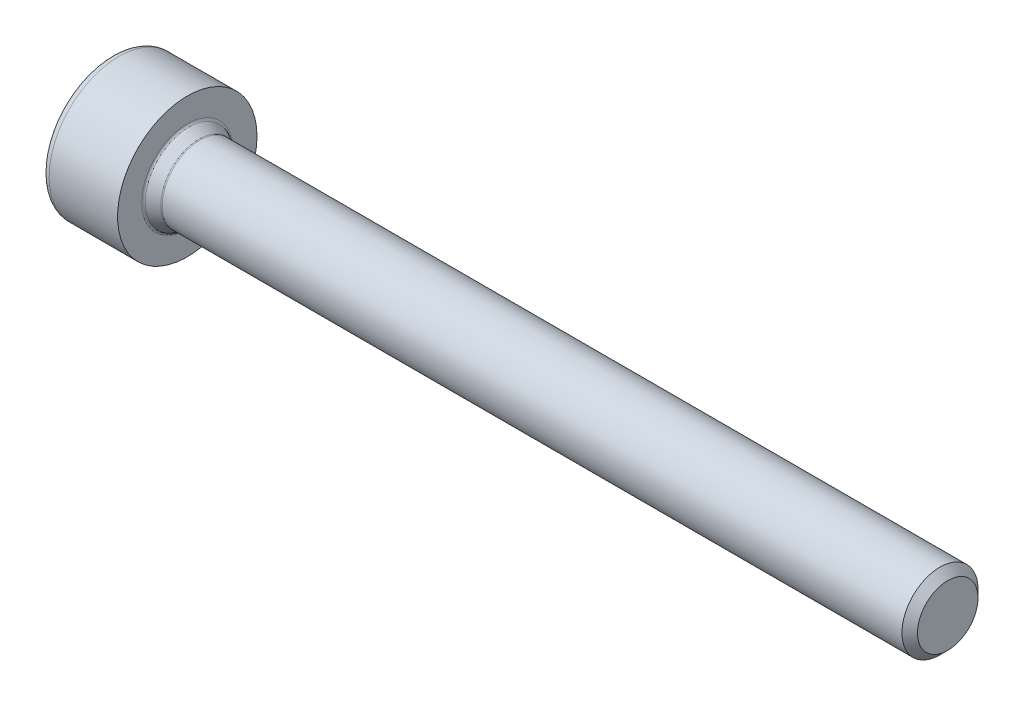
ISO-10303-21;
HEADER;
FILE_DESCRIPTION(('STEP AP214'),'2;1');
FILE_NAME('part.step','',(''),(''),'','','');
FILE_SCHEMA(('AUTOMOTIVE_DESIGN { 1 0 10303 214 1 1 1 1 }'));
ENDSEC;
DATA;
#1=APPLICATION_CONTEXT('core data for automotive mechanical design processes');
#2=APPLICATION_PROTOCOL_DEFINITION('international standard','automotive_design',2000,#1);
#3=PRODUCT_CONTEXT('',#1,'mechanical');
#4=PRODUCT('Part','Part','',(#3));
#5=PRODUCT_RELATED_PRODUCT_CATEGORY('part','',(#4));
#6=PRODUCT_DEFINITION_FORMATION('','',#4);
#7=PRODUCT_DEFINITION_CONTEXT('part definition',#1,'design');
#8=PRODUCT_DEFINITION('design','',#6,#7);
#9=PRODUCT_DEFINITION_SHAPE('','',#8);
#10=(LENGTH_UNIT() NAMED_UNIT(*) SI_UNIT(.MILLI.,.METRE.));
#11=(NAMED_UNIT(*) PLANE_ANGLE_UNIT() SI_UNIT($,.RADIAN.));
#12=(NAMED_UNIT(*) SI_UNIT($,.STERADIAN.) SOLID_ANGLE_UNIT());
#13=UNCERTAINTY_MEASURE_WITH_UNIT(LENGTH_MEASURE(1.E-05),#10,'distance_accuracy_value','');
#14=(GEOMETRIC_REPRESENTATION_CONTEXT(3) GLOBAL_UNCERTAINTY_ASSIGNED_CONTEXT((#13)) GLOBAL_UNIT_ASSIGNED_CONTEXT((#10,
#11,#12)) REPRESENTATION_CONTEXT('',''));
#15=CARTESIAN_POINT('',(0.,0.,0.));
#16=DIRECTION('',(0.,0.,1.));
#17=DIRECTION('',(1.,0.,0.));
#18=AXIS2_PLACEMENT_3D('',#15,#16,#17);
#19=CARTESIAN_POINT('',(0.51,0.,0.));
#20=DIRECTION('',(-1.,0.,0.));
#21=DIRECTION('',(0.,0.,1.));
#22=AXIS2_PLACEMENT_3D('',#19,#20,#21);
#23=TOROIDAL_SURFACE('',#22,1.6,0.1);
#24=CARTESIAN_POINT('',(0.51,0.,0.));
#25=DIRECTION('',(-1.,0.,0.));
#26=DIRECTION('',(0.,0.,-1.));
#27=AXIS2_PLACEMENT_3D('',#24,#25,#26);
#28=CIRCLE('',#27,1.5);
#29=CARTESIAN_POINT('',(0.51,0.,-1.5));
#30=VERTEX_POINT('',#29);
#31=EDGE_CURVE('E11',#30,#30,#28,.T.);
#32=ORIENTED_EDGE('',*,*,#31,.T.);
#33=EDGE_LOOP('',(#32));
#34=FACE_BOUND('',#33,.T.);
#35=CARTESIAN_POINT('',(0.4661576367979,0.,0.));
#36=DIRECTION('',(1.,0.,0.));
#37=DIRECTION('',(0.,0.,1.));
#38=AXIS2_PLACEMENT_3D('',#35,#36,#37);
#39=CIRCLE('',#38,1.510123155436);
#40=CARTESIAN_POINT('',(0.4661576367979,0.,1.510123155436));
#41=VERTEX_POINT('',#40);
#42=EDGE_CURVE('E32',#41,#41,#39,.T.);
#43=ORIENTED_EDGE('',*,*,#42,.T.);
#44=EDGE_LOOP('',(#43));
#45=FACE_BOUND('',#44,.T.);
#46=ADVANCED_FACE('F17',(#34,#45),#23,.F.);
#47=CARTESIAN_POINT('',(15.10175,0.,0.));
#48=DIRECTION('',(1.,0.,0.));
#49=DIRECTION('',(0.,0.,-1.));
#50=AXIS2_PLACEMENT_3D('',#47,#48,#49);
#51=CYLINDRICAL_SURFACE('',#50,1.5);
#52=CARTESIAN_POINT('',(29.6935,0.,0.));
#53=DIRECTION('',(1.,0.,0.));
#54=DIRECTION('',(0.,0.,-1.));
#55=AXIS2_PLACEMENT_3D('',#52,#53,#54);
#56=CIRCLE('',#55,1.5);
#57=CARTESIAN_POINT('',(29.6935,0.,-1.5));
#58=VERTEX_POINT('',#57);
#59=EDGE_CURVE('E691',#58,#58,#56,.T.);
#60=ORIENTED_EDGE('',*,*,#59,.F.);
#61=EDGE_LOOP('',(#60));
#62=FACE_BOUND('',#61,.T.);
#63=ORIENTED_EDGE('',*,*,#31,.F.);
#64=EDGE_LOOP('',(#63));
#65=FACE_BOUND('',#64,.T.);
#66=ADVANCED_FACE('F381',(#62,#65),#51,.T.);
#67=CARTESIAN_POINT('',(29.84675,0.,0.));
#68=DIRECTION('',(-1.,0.,0.));
#69=DIRECTION('',(0.,0.,-1.));
#70=AXIS2_PLACEMENT_3D('',#67,#68,#69);
#71=CONICAL_SURFACE('',#70,1.34675,0.7853981633973);
#72=CARTESIAN_POINT('',(30.,0.,0.));
#73=DIRECTION('',(1.,0.,0.));
#74=DIRECTION('',(0.,0.,1.));
#75=AXIS2_PLACEMENT_3D('',#72,#73,#74);
#76=CIRCLE('',#75,1.1935);
#77=CARTESIAN_POINT('',(30.,0.,1.1935));
#78=VERTEX_POINT('',#77);
#79=EDGE_CURVE('E688',#78,#78,#76,.T.);
#80=ORIENTED_EDGE('',*,*,#79,.F.);
#81=EDGE_LOOP('',(#80));
#82=FACE_BOUND('',#81,.T.);
#83=ORIENTED_EDGE('',*,*,#59,.T.);
#84=EDGE_LOOP('',(#83));
#85=FACE_BOUND('',#84,.T.);
#86=ADVANCED_FACE('F387',(#82,#85),#71,.T.);
#87=CARTESIAN_POINT('',(30.,0.,-0.59675));
#88=DIRECTION('',(1.,0.,0.));
#89=DIRECTION('',(0.,0.,1.));
#90=AXIS2_PLACEMENT_3D('',#87,#88,#89);
#91=PLANE('',#90);
#92=ORIENTED_EDGE('',*,*,#79,.T.);
#93=EDGE_LOOP('',(#92));
#94=FACE_BOUND('',#93,.T.);
#95=ADVANCED_FACE('F394',(#94),#91,.T.);
#96=CARTESIAN_POINT('',(0.2611576367979,0.,0.));
#97=DIRECTION('',(-1.,0.,0.));
#98=DIRECTION('',(0.,0.,-1.));
#99=AXIS2_PLACEMENT_3D('',#96,#97,#98);
#100=CONICAL_SURFACE('',#99,1.610123155436,0.453844001521399);
#101=ORIENTED_EDGE('',*,*,#42,.F.);
#102=EDGE_LOOP('',(#101));
#103=FACE_BOUND('',#102,.T.);
#104=CARTESIAN_POINT('',(0.05615763679786,0.,0.));
#105=DIRECTION('',(-1.,0.,0.));
#106=DIRECTION('',(0.,0.,1.));
#107=AXIS2_PLACEMENT_3D('',#104,#105,#106);
#108=CIRCLE('',#107,1.710123155436);
#109=CARTESIAN_POINT('',(0.05615763679786,0.,1.710123155436));
#110=VERTEX_POINT('',#109);
#111=EDGE_CURVE('E683',#110,#110,#108,.T.);
#112=ORIENTED_EDGE('',*,*,#111,.F.);
#113=EDGE_LOOP('',(#112));
#114=FACE_BOUND('',#113,.T.);
#115=ADVANCED_FACE('F398',(#103,#114),#100,.T.);
#116=CARTESIAN_POINT('',(0.1,0.,0.));
#117=DIRECTION('',(-1.,0.,0.));
#118=DIRECTION('',(0.,0.,1.));
#119=AXIS2_PLACEMENT_3D('',#116,#117,#118);
#120=TOROIDAL_SURFACE('',#119,1.8,0.1);
#121=ORIENTED_EDGE('',*,*,#111,.T.);
#122=EDGE_LOOP('',(#121));
#123=FACE_BOUND('',#122,.T.);
#124=CARTESIAN_POINT('',(0.,0.,0.));
#125=DIRECTION('',(-1.,0.,0.));
#126=DIRECTION('',(0.,0.,-1.));
#127=AXIS2_PLACEMENT_3D('',#124,#125,#126);
#128=CIRCLE('',#127,1.8);
#129=CARTESIAN_POINT('',(0.,0.,-1.8));
#130=VERTEX_POINT('',#129);
#131=EDGE_CURVE('E430',#130,#130,#128,.T.);
#132=ORIENTED_EDGE('',*,*,#131,.F.);
#133=EDGE_LOOP('',(#132));
#134=FACE_BOUND('',#133,.T.);
#135=ADVANCED_FACE('F402',(#123,#134),#120,.F.);
#136=CARTESIAN_POINT('',(0.,0.,-2.275));
#137=DIRECTION('',(1.,0.,0.));
#138=DIRECTION('',(0.,0.,1.));
#139=AXIS2_PLACEMENT_3D('',#136,#137,#138);
#140=PLANE('',#139);
#141=CARTESIAN_POINT('',(0.,0.,0.));
#142=DIRECTION('',(1.,0.,0.));
#143=DIRECTION('',(0.,0.,-1.));
#144=AXIS2_PLACEMENT_3D('',#141,#142,#143);
#145=CIRCLE('',#144,2.75);
#146=CARTESIAN_POINT('',(0.,0.,-2.75));
#147=VERTEX_POINT('',#146);
#148=EDGE_CURVE('E680',#147,#147,#145,.T.);
#149=ORIENTED_EDGE('',*,*,#148,.T.);
#150=EDGE_LOOP('',(#149));
#151=FACE_BOUND('',#150,.T.);
#152=ORIENTED_EDGE('',*,*,#131,.T.);
#153=EDGE_LOOP('',(#152));
#154=FACE_BOUND('',#153,.T.);
#155=ADVANCED_FACE('F406',(#151,#154),#140,.T.);
#156=CARTESIAN_POINT('',(-1.35,0.,0.));
#157=DIRECTION('',(1.,0.,0.));
#158=DIRECTION('',(0.,0.,-1.));
#159=AXIS2_PLACEMENT_3D('',#156,#157,#158);
#160=CYLINDRICAL_SURFACE('',#159,2.75);
#161=ORIENTED_EDGE('',*,*,#148,.F.);
#162=EDGE_LOOP('',(#161));
#163=FACE_BOUND('',#162,.T.);
#164=CARTESIAN_POINT('',(-2.7,0.,0.));
#165=DIRECTION('',(-1.,0.,0.));
#166=DIRECTION('',(0.,0.,-1.));
#167=AXIS2_PLACEMENT_3D('',#164,#165,#166);
#168=CIRCLE('',#167,2.75);
#169=CARTESIAN_POINT('',(-2.7,0.,-2.75));
#170=VERTEX_POINT('',#169);
#171=EDGE_CURVE('E427',#170,#170,#168,.T.);
#172=ORIENTED_EDGE('',*,*,#171,.F.);
#173=EDGE_LOOP('',(#172));
#174=FACE_BOUND('',#173,.T.);
#175=ADVANCED_FACE('F410',(#163,#174),#160,.T.);
#176=CARTESIAN_POINT('',(-2.7,0.,0.));
#177=DIRECTION('',(-1.,0.,0.));
#178=DIRECTION('',(0.,0.,1.));
#179=AXIS2_PLACEMENT_3D('',#176,#177,#178);
#180=TOROIDAL_SURFACE('',#179,2.45,0.3);
#181=ORIENTED_EDGE('',*,*,#171,.T.);
#182=EDGE_LOOP('',(#181));
#183=FACE_BOUND('',#182,.T.);
#184=CARTESIAN_POINT('',(-3.,0.,0.));
#185=DIRECTION('',(-1.,0.,0.));
#186=DIRECTION('',(0.,0.,1.));
#187=AXIS2_PLACEMENT_3D('',#184,#185,#186);
#188=CIRCLE('',#187,2.45);
#189=CARTESIAN_POINT('',(-3.,0.,2.45));
#190=VERTEX_POINT('',#189);
#191=EDGE_CURVE('E227',#190,#190,#188,.T.);
#192=ORIENTED_EDGE('',*,*,#191,.F.);
#193=EDGE_LOOP('',(#192));
#194=FACE_BOUND('',#193,.T.);
#195=ADVANCED_FACE('F414',(#183,#194),#180,.T.);
#196=CARTESIAN_POINT('',(-3.,0.,-1.9425));
#197=DIRECTION('',(-1.,0.,0.));
#198=DIRECTION('',(0.,0.,-1.));
#199=AXIS2_PLACEMENT_3D('',#196,#197,#198);
#200=PLANE('',#199);
#201=ORIENTED_EDGE('',*,*,#191,.T.);
#202=EDGE_LOOP('',(#201));
#203=FACE_BOUND('',#202,.T.);
#204=DIRECTION('',(0.,-1.,1.396594986924E-11));
#205=VECTOR('',#204,1.);
#206=CARTESIAN_POINT('',(-3.,-0.7047872019262,-1.25));
#207=LINE('',#206,#205);
#208=CARTESIAN_POINT('',(-2.99999999999999,-0.704787201926908,-1.25));
#209=VERTEX_POINT('',#208);
#210=CARTESIAN_POINT('',(-3.,-0.721687836487,-1.25));
#211=VERTEX_POINT('',#210);
#212=EDGE_CURVE('E41',#209,#211,#207,.T.);
#213=ORIENTED_EDGE('',*,*,#212,.F.);
#214=CARTESIAN_POINT('',(-3.,0.,0.));
#215=DIRECTION('',(1.,0.,0.));
#216=DIRECTION('',(0.,-0.491140907266199,-0.871080139372799));
#217=AXIS2_PLACEMENT_3D('',#214,#215,#216);
#218=CIRCLE('',#217,1.435);
#219=CARTESIAN_POINT('',(-3.,0.7047872019269,-1.25));
#220=VERTEX_POINT('',#219);
#221=EDGE_CURVE('E225',#209,#220,#218,.T.);
#222=ORIENTED_EDGE('',*,*,#221,.T.);
#223=DIRECTION('',(0.,-1.,-6.411461464115E-12));
#224=VECTOR('',#223,1.);
#225=CARTESIAN_POINT('',(-3.,0.721687836487,-1.25));
#226=LINE('',#225,#224);
#227=CARTESIAN_POINT('',(-3.,0.721687836487,-1.25));
#228=VERTEX_POINT('',#227);
#229=EDGE_CURVE('E218',#228,#220,#226,.T.);
#230=ORIENTED_EDGE('',*,*,#229,.F.);
#231=DIRECTION('',(0.,0.50000000001208,0.866025403777465));
#232=VECTOR('',#231,1.);
#233=CARTESIAN_POINT('',(-3.,0.721687836487,-1.25));
#234=LINE('',#233,#232);
#235=CARTESIAN_POINT('',(-3.,0.730138153767252,-1.23536362113076));
#236=VERTEX_POINT('',#235);
#237=EDGE_CURVE('E228',#228,#236,#234,.T.);
#238=ORIENTED_EDGE('',*,*,#237,.T.);
#239=CARTESIAN_POINT('',(-3.,0.,0.));
#240=DIRECTION('',(1.,0.,0.));
#241=DIRECTION('',(0.,0.508807075795911,-0.860880572216619));
#242=AXIS2_PLACEMENT_3D('',#239,#240,#241);
#243=CIRCLE('',#242,1.435);
#244=CARTESIAN_POINT('',(-3.,1.434925355694,-0.01463637886948));
#245=VERTEX_POINT('',#244);
#246=EDGE_CURVE('E234',#236,#245,#243,.T.);
#247=ORIENTED_EDGE('',*,*,#246,.T.);
#248=DIRECTION('',(0.,0.499999999994388,0.866025403787679));
#249=VECTOR('',#248,1.);
#250=CARTESIAN_POINT('',(-3.,1.434925355694,-0.01463637886948));
#251=LINE('',#250,#249);
#252=CARTESIAN_POINT('',(-3.,1.443375672974,0.));
#253=VERTEX_POINT('',#252);
#254=EDGE_CURVE('E240',#245,#253,#251,.T.);
#255=ORIENTED_EDGE('',*,*,#254,.T.);
#256=DIRECTION('',(0.,-0.499999999987911,0.866025403791418));
#257=VECTOR('',#256,1.);
#258=CARTESIAN_POINT('',(-3.,1.443375672974,0.));
#259=LINE('',#258,#257);
#260=CARTESIAN_POINT('',(-3.,1.434925355694,0.0146363788692702));
#261=VERTEX_POINT('',#260);
#262=EDGE_CURVE('E255',#253,#261,#259,.T.);
#263=ORIENTED_EDGE('',*,*,#262,.T.);
#264=CARTESIAN_POINT('',(-3.,0.,0.));
#265=DIRECTION('',(1.,0.,0.));
#266=DIRECTION('',(0.,0.999947983062032,0.0101995671561803));
#267=AXIS2_PLACEMENT_3D('',#264,#265,#266);
#268=CIRCLE('',#267,1.435);
#269=CARTESIAN_POINT('',(-3.,0.7301381537673,1.235363621131));
#270=VERTEX_POINT('',#269);
#271=EDGE_CURVE('E249',#261,#270,#268,.T.);
#272=ORIENTED_EDGE('',*,*,#271,.T.);
#273=DIRECTION('',(0.,-0.500000000005602,0.866025403781204));
#274=VECTOR('',#273,1.);
#275=CARTESIAN_POINT('',(-3.,0.7301381537673,1.235363621131));
#276=LINE('',#275,#274);
#277=CARTESIAN_POINT('',(-3.,0.721687836487,1.25));
#278=VERTEX_POINT('',#277);
#279=EDGE_CURVE('E256',#270,#278,#276,.T.);
#280=ORIENTED_EDGE('',*,*,#279,.T.);
#281=DIRECTION('',(0.,1.,-1.396594986924E-11));
#282=VECTOR('',#281,1.);
#283=CARTESIAN_POINT('',(-3.,0.7047872019262,1.25));
#284=LINE('',#283,#282);
#285=CARTESIAN_POINT('',(-2.99999999999999,0.704787201926908,1.25));
#286=VERTEX_POINT('',#285);
#287=EDGE_CURVE('E265',#286,#278,#284,.T.);
#288=ORIENTED_EDGE('',*,*,#287,.F.);
#289=CARTESIAN_POINT('',(-3.,0.,0.));
#290=DIRECTION('',(1.,0.,0.));
#291=DIRECTION('',(0.,0.491140907266199,0.871080139372799));
#292=AXIS2_PLACEMENT_3D('',#289,#290,#291);
#293=CIRCLE('',#292,1.435);
#294=CARTESIAN_POINT('',(-3.,-0.7047872019266,1.25));
#295=VERTEX_POINT('',#294);
#296=EDGE_CURVE('E271',#286,#295,#293,.T.);
#297=ORIENTED_EDGE('',*,*,#296,.T.);
#298=DIRECTION('',(0.,1.,6.411461464115E-12));
#299=VECTOR('',#298,1.);
#300=CARTESIAN_POINT('',(-3.,-0.721687836487,1.25));
#301=LINE('',#300,#299);
#302=CARTESIAN_POINT('',(-3.,-0.721687836487,1.25));
#303=VERTEX_POINT('',#302);
#304=EDGE_CURVE('E264',#303,#295,#301,.T.);
#305=ORIENTED_EDGE('',*,*,#304,.F.);
#306=DIRECTION('',(0.,-0.50000000001208,-0.866025403777465));
#307=VECTOR('',#306,1.);
#308=CARTESIAN_POINT('',(-3.,-0.721687836487,1.25));
#309=LINE('',#308,#307);
#310=CARTESIAN_POINT('',(-3.,-0.730138153767252,1.23536362113076));
#311=VERTEX_POINT('',#310);
#312=EDGE_CURVE('E169',#303,#311,#309,.T.);
#313=ORIENTED_EDGE('',*,*,#312,.T.);
#314=CARTESIAN_POINT('',(-3.,0.,0.));
#315=DIRECTION('',(1.,0.,0.));
#316=DIRECTION('',(0.,-0.508807075795911,0.860880572216619));
#317=AXIS2_PLACEMENT_3D('',#314,#315,#316);
#318=CIRCLE('',#317,1.435);
#319=CARTESIAN_POINT('',(-3.,-1.434925355694,0.01463637886948));
#320=VERTEX_POINT('',#319);
#321=EDGE_CURVE('E277',#311,#320,#318,.T.);
#322=ORIENTED_EDGE('',*,*,#321,.T.);
#323=DIRECTION('',(0.,-0.499999999994388,-0.866025403787679));
#324=VECTOR('',#323,1.);
#325=CARTESIAN_POINT('',(-3.,-1.434925355694,0.01463637886948));
#326=LINE('',#325,#324);
#327=CARTESIAN_POINT('',(-3.,-1.443375672974,0.));
#328=VERTEX_POINT('',#327);
#329=EDGE_CURVE('E212',#320,#328,#326,.T.);
#330=ORIENTED_EDGE('',*,*,#329,.T.);
#331=DIRECTION('',(0.,0.499999999987911,-0.866025403791418));
#332=VECTOR('',#331,1.);
#333=CARTESIAN_POINT('',(-3.,-1.443375672974,0.));
#334=LINE('',#333,#332);
#335=CARTESIAN_POINT('',(-3.,-1.434925355694,-0.0146363788692702));
#336=VERTEX_POINT('',#335);
#337=EDGE_CURVE('E210',#328,#336,#334,.T.);
#338=ORIENTED_EDGE('',*,*,#337,.T.);
#339=CARTESIAN_POINT('',(-3.,0.,0.));
#340=DIRECTION('',(1.,0.,0.));
#341=DIRECTION('',(0.,-0.999947983062032,-0.0101995671561803));
#342=AXIS2_PLACEMENT_3D('',#339,#340,#341);
#343=CIRCLE('',#342,1.435);
#344=CARTESIAN_POINT('',(-3.,-0.7301381537674,-1.235363621131));
#345=VERTEX_POINT('',#344);
#346=EDGE_CURVE('E105',#336,#345,#343,.T.);
#347=ORIENTED_EDGE('',*,*,#346,.T.);
#348=DIRECTION('',(0.,0.500000000005602,-0.866025403781204));
#349=VECTOR('',#348,1.);
#350=CARTESIAN_POINT('',(-3.,-0.7301381537674,-1.235363621131));
#351=LINE('',#350,#349);
#352=EDGE_CURVE('E115',#345,#211,#351,.T.);
#353=ORIENTED_EDGE('',*,*,#352,.T.);
#354=EDGE_LOOP('',(#213,#222,#230,#238,#247,#255,#263,#272,#280,#288,#297,#305,#313,#322,#330,
#338,#347,#353));
#355=FACE_BOUND('',#354,.T.);
#356=ADVANCED_FACE('F417',(#203,#355),#200,.T.);
#357=CARTESIAN_POINT('',(-1.15,-1.443375672974,0.));
#358=DIRECTION('',(0.,-0.866025403784429,-0.500000000000017));
#359=DIRECTION('',(0.,-0.500000000000017,0.866025403784429));
#360=AXIS2_PLACEMENT_3D('',#357,#358,#359);
#361=PLANE('',#360);
#362=DIRECTION('',(1.,0.,0.));
#363=VECTOR('',#362,1.);
#364=CARTESIAN_POINT('',(-3.,-1.443375672974,0.));
#365=LINE('',#364,#363);
#366=CARTESIAN_POINT('',(-1.15,-1.443375672974,0.));
#367=VERTEX_POINT('',#366);
#368=EDGE_CURVE('E204',#328,#367,#365,.T.);
#369=ORIENTED_EDGE('',*,*,#368,.T.);
#370=DIRECTION('',(0.,-0.500000000000017,0.866025403784429));
#371=VECTOR('',#370,1.);
#372=CARTESIAN_POINT('',(-1.15,-1.082531754731,-0.625));
#373=LINE('',#372,#371);
#374=CARTESIAN_POINT('',(-1.15,-1.082531754731,-0.625));
#375=VERTEX_POINT('',#374);
#376=EDGE_CURVE('E181',#375,#367,#373,.T.);
#377=ORIENTED_EDGE('',*,*,#376,.F.);
#378=DIRECTION('',(0.,-0.500000000000017,0.866025403784429));
#379=VECTOR('',#378,1.);
#380=CARTESIAN_POINT('',(-1.15,-0.721687836487,-1.25));
#381=LINE('',#380,#379);
#382=CARTESIAN_POINT('',(-1.15,-0.721687836487,-1.25));
#383=VERTEX_POINT('',#382);
#384=EDGE_CURVE('E188',#383,#375,#381,.T.);
#385=ORIENTED_EDGE('',*,*,#384,.F.);
#386=DIRECTION('',(1.,0.,0.));
#387=VECTOR('',#386,1.);
#388=CARTESIAN_POINT('',(-3.,-0.721687836487,-1.25));
#389=LINE('',#388,#387);
#390=EDGE_CURVE('E291',#211,#383,#389,.T.);
#391=ORIENTED_EDGE('',*,*,#390,.F.);
#392=ORIENTED_EDGE('',*,*,#352,.F.);
#393=CARTESIAN_POINT('',(-3.,-0.7301381537674,-1.235363621131));
#394=CARTESIAN_POINT('',(-2.978562651578,-0.7519621844124,-1.197563291227));
#395=CARTESIAN_POINT('',(-2.939689272352,-0.7946369146834,-1.123648490198));
#396=CARTESIAN_POINT('',(-2.893521387199,-0.85525307303,-1.018658224183));
#397=CARTESIAN_POINT('',(-2.858217842369,-0.9136893090595,-0.9174436943764));
#398=CARTESIAN_POINT('',(-2.833317634368,-0.970488201716,-0.8190651264818));
#399=CARTESIAN_POINT('',(-2.81836504463,-1.026464797592,-0.7221108183906));
#400=CARTESIAN_POINT('',(-2.815,-1.063864153099,-0.6573332344809));
#401=CARTESIAN_POINT('',(-2.815,-1.082531754731,-0.625));
#402=B_SPLINE_CURVE_WITH_KNOTS('',3,(#393,#394,#395,#396,#397,#398,#399,#400,#401),
.UNSPECIFIED.,.F.,.F.,(4,1,1,1,1,1,4),(0.,0.1666666666667,0.3333333333333,0.5,0.6666666666667,
0.8333333333333,1.),.UNSPECIFIED.);
#403=CARTESIAN_POINT('',(-2.815,-1.082531754731,-0.625));
#404=VERTEX_POINT('',#403);
#405=EDGE_CURVE('E200',#345,#404,#402,.T.);
#406=ORIENTED_EDGE('',*,*,#405,.T.);
#407=CARTESIAN_POINT('',(-2.8149999999999,-1.0825317547306,-0.62499999999977));
#408=CARTESIAN_POINT('',(-2.81496785270438,-1.10173069672346,-0.591746457016578));
#409=CARTESIAN_POINT('',(-2.8167685143763,-1.12091987742702,-0.558509821082382));
#410=CARTESIAN_POINT('',(-2.82378282879434,-1.15910898332761,-0.492364349366938));
#411=CARTESIAN_POINT('',(-2.82899042505695,-1.17810918373836,-0.459455036901525));
#412=CARTESIAN_POINT('',(-2.84246640129993,-1.21553848926201,-0.394625578042558));
#413=CARTESIAN_POINT('',(-2.8506879852696,-1.23397188551018,-0.362697999184671));
#414=CARTESIAN_POINT('',(-2.86982507004518,-1.27048736991153,-0.299451324938551));
#415=CARTESIAN_POINT('',(-2.88074136635811,-1.28856935262031,-0.268132412185355));
#416=CARTESIAN_POINT('',(-2.90757365650076,-1.32835068916774,-0.199229116092227));
#417=CARTESIAN_POINT('',(-2.92406186281479,-1.34995237159165,-0.161813904605039));
#418=CARTESIAN_POINT('',(-2.95998951151067,-1.39277863287142,-0.0876366441702561));
#419=CARTESIAN_POINT('',(-2.97945549868663,-1.41399768085219,-0.0508841749793364));
#420=CARTESIAN_POINT('',(-2.99999999999971,-1.43492535569369,-0.0146363788695677));
#421=B_SPLINE_CURVE_WITH_KNOTS('',3,(#407,#408,#409,#410,#411,#412,#413,#414,#415,#416,#417,
#418,#419,#420),.UNSPECIFIED.,.F.,.F.,(4,2,2,2,2,2,4),(0.,0.115120325309989,0.230036556089488,
0.343239313166312,0.456475528920214,0.595093846087289,0.735028832968605),.UNSPECIFIED.);
#422=EDGE_CURVE('E205',#404,#336,#421,.T.);
#423=ORIENTED_EDGE('',*,*,#422,.T.);
#424=ORIENTED_EDGE('',*,*,#337,.F.);
#425=EDGE_LOOP('',(#369,#377,#385,#391,#392,#406,#423,#424));
#426=FACE_BOUND('',#425,.T.);
#427=ADVANCED_FACE('F298',(#426),#361,.F.);
#428=CARTESIAN_POINT('',(-2.9075,0.,0.));
#429=DIRECTION('',(-1.,0.,0.));
#430=DIRECTION('',(0.,0.,-1.));
#431=AXIS2_PLACEMENT_3D('',#428,#429,#430);
#432=CONICAL_SURFACE('',#431,1.3425,0.7853981633973);
#433=ORIENTED_EDGE('',*,*,#346,.F.);
#434=ORIENTED_EDGE('',*,*,#422,.F.);
#435=ORIENTED_EDGE('',*,*,#405,.F.);
#436=EDGE_LOOP('',(#433,#434,#435));
#437=FACE_BOUND('',#436,.T.);
#438=ADVANCED_FACE('F301',(#437),#432,.F.);
#439=CARTESIAN_POINT('',(-1.15,-0.721687836487,-1.25));
#440=DIRECTION('',(0.,0.,-1.));
#441=DIRECTION('',(0.,-1.,0.));
#442=AXIS2_PLACEMENT_3D('',#439,#440,#441);
#443=PLANE('',#442);
#444=ORIENTED_EDGE('',*,*,#390,.T.);
#445=DIRECTION('',(0.,-1.,0.));
#446=VECTOR('',#445,1.);
#447=CARTESIAN_POINT('',(-1.15,0.,-1.25));
#448=LINE('',#447,#446);
#449=CARTESIAN_POINT('',(-1.15,0.,-1.25));
#450=VERTEX_POINT('',#449);
#451=EDGE_CURVE('E189',#450,#383,#448,.T.);
#452=ORIENTED_EDGE('',*,*,#451,.F.);
#453=DIRECTION('',(0.,-1.,0.));
#454=VECTOR('',#453,1.);
#455=CARTESIAN_POINT('',(-1.15,0.721687836487,-1.25));
#456=LINE('',#455,#454);
#457=CARTESIAN_POINT('',(-1.15,0.721687836487,-1.25));
#458=VERTEX_POINT('',#457);
#459=EDGE_CURVE('E198',#458,#450,#456,.T.);
#460=ORIENTED_EDGE('',*,*,#459,.F.);
#461=DIRECTION('',(1.,0.,0.));
#462=VECTOR('',#461,1.);
#463=CARTESIAN_POINT('',(-3.,0.721687836487,-1.25));
#464=LINE('',#463,#462);
#465=EDGE_CURVE('E224',#228,#458,#464,.T.);
#466=ORIENTED_EDGE('',*,*,#465,.F.);
#467=ORIENTED_EDGE('',*,*,#229,.T.);
#468=CARTESIAN_POINT('',(-3.,0.7047872019266,-1.25));
#469=CARTESIAN_POINT('',(-2.978562651578,0.6611391406364,-1.25));
#470=CARTESIAN_POINT('',(-2.939689272352,0.5757896800941,-1.25));
#471=CARTESIAN_POINT('',(-2.893521387199,0.4545573634011,-1.25));
#472=CARTESIAN_POINT('',(-2.858217842369,0.337684891342,-1.25));
#473=CARTESIAN_POINT('',(-2.833317634368,0.2240871060292,-1.25));
#474=CARTESIAN_POINT('',(-2.81836504463,0.112133914278,-1.25));
#475=CARTESIAN_POINT('',(-2.815,0.03733520326262,-1.25));
#476=CARTESIAN_POINT('',(-2.815,0.,-1.25));
#477=B_SPLINE_CURVE_WITH_KNOTS('',3,(#468,#469,#470,#471,#472,#473,#474,#475,#476),
.UNSPECIFIED.,.F.,.F.,(4,1,1,1,1,1,4),(0.,0.1666666666667,0.3333333333333,0.5,0.6666666666667,
0.8333333333333,1.),.UNSPECIFIED.);
#478=CARTESIAN_POINT('',(-2.81499999999999,0.,-1.25));
#479=VERTEX_POINT('',#478);
#480=EDGE_CURVE('E213',#220,#479,#477,.T.);
#481=ORIENTED_EDGE('',*,*,#480,.T.);
#482=CARTESIAN_POINT('',(-2.81499999999997,0.,-1.25));
#483=CARTESIAN_POINT('',(-2.81496785270444,-0.0383978839857061,-1.25));
#484=CARTESIAN_POINT('',(-2.81676851437635,-0.076776245392834,-1.25));
#485=CARTESIAN_POINT('',(-2.82378282879438,-0.153154457194003,-1.25));
#486=CARTESIAN_POINT('',(-2.82899042505698,-0.191154858015504,-1.25));
#487=CARTESIAN_POINT('',(-2.84246640129995,-0.266013469062785,-1.25));
#488=CARTESIAN_POINT('',(-2.8506879852696,-0.302880261559132,-1.25));
#489=CARTESIAN_POINT('',(-2.86982507004516,-0.37591123036182,-1.25));
#490=CARTESIAN_POINT('',(-2.88074136635809,-0.412075195779387,-1.25));
#491=CARTESIAN_POINT('',(-2.90757365650077,-0.491637868874359,-1.25));
#492=CARTESIAN_POINT('',(-2.92406186281484,-0.534841233722319,-1.25));
#493=CARTESIAN_POINT('',(-2.95998951151084,-0.620493756282116,-1.25));
#494=CARTESIAN_POINT('',(-2.97945549868686,-0.662931852243763,-1.25));
#495=CARTESIAN_POINT('',(-3.00000000000001,-0.704787201926896,-1.25));
#496=B_SPLINE_CURVE_WITH_KNOTS('',3,(#482,#483,#484,#485,#486,#487,#488,#489,#490,#491,#492,
#493,#494,#495),.UNSPECIFIED.,.F.,.F.,(4,2,2,2,2,2,4),(0.,0.115120325309978,0.230036556089467,
0.343239313166279,0.45647552892017,0.595093846087656,0.735028832969392),.UNSPECIFIED.);
#497=EDGE_CURVE('E219',#479,#209,#496,.T.);
#498=ORIENTED_EDGE('',*,*,#497,.T.);
#499=ORIENTED_EDGE('',*,*,#212,.T.);
#500=EDGE_LOOP('',(#444,#452,#460,#466,#467,#481,#498,#499));
#501=FACE_BOUND('',#500,.T.);
#502=ADVANCED_FACE('F304',(#501),#443,.F.);
#503=CARTESIAN_POINT('',(-2.9075,0.,0.));
#504=DIRECTION('',(-1.,0.,0.));
#505=DIRECTION('',(0.,0.,-1.));
#506=AXIS2_PLACEMENT_3D('',#503,#504,#505);
#507=CONICAL_SURFACE('',#506,1.3425,0.7853981633973);
#508=ORIENTED_EDGE('',*,*,#221,.F.);
#509=ORIENTED_EDGE('',*,*,#497,.F.);
#510=ORIENTED_EDGE('',*,*,#480,.F.);
#511=EDGE_LOOP('',(#508,#509,#510));
#512=FACE_BOUND('',#511,.T.);
#513=ADVANCED_FACE('F307',(#512),#507,.F.);
#514=CARTESIAN_POINT('',(-1.15,0.721687836487,-1.25));
#515=DIRECTION('',(0.,0.866025403784429,-0.500000000000017));
#516=DIRECTION('',(0.,-0.500000000000017,-0.866025403784429));
#517=AXIS2_PLACEMENT_3D('',#514,#515,#516);
#518=PLANE('',#517);
#519=ORIENTED_EDGE('',*,*,#465,.T.);
#520=DIRECTION('',(0.,-0.500000000000017,-0.866025403784429));
#521=VECTOR('',#520,1.);
#522=CARTESIAN_POINT('',(-1.15,1.082531754731,-0.625));
#523=LINE('',#522,#521);
#524=CARTESIAN_POINT('',(-1.15,1.082531754731,-0.625));
#525=VERTEX_POINT('',#524);
#526=EDGE_CURVE('E185',#525,#458,#523,.T.);
#527=ORIENTED_EDGE('',*,*,#526,.F.);
#528=DIRECTION('',(0.,-0.500000000000017,-0.866025403784429));
#529=VECTOR('',#528,1.);
#530=CARTESIAN_POINT('',(-1.15,1.443375672974,0.));
#531=LINE('',#530,#529);
#532=CARTESIAN_POINT('',(-1.15,1.443375672974,0.));
#533=VERTEX_POINT('',#532);
#534=EDGE_CURVE('E194',#533,#525,#531,.T.);
#535=ORIENTED_EDGE('',*,*,#534,.F.);
#536=DIRECTION('',(1.,0.,0.));
#537=VECTOR('',#536,1.);
#538=CARTESIAN_POINT('',(-3.,1.443375672974,0.));
#539=LINE('',#538,#537);
#540=EDGE_CURVE('E247',#253,#533,#539,.T.);
#541=ORIENTED_EDGE('',*,*,#540,.F.);
#542=ORIENTED_EDGE('',*,*,#254,.F.);
#543=CARTESIAN_POINT('',(-3.,1.434925355694,-0.01463637886948));
#544=CARTESIAN_POINT('',(-2.978562651578,1.413101325049,-0.05243670877273));
#545=CARTESIAN_POINT('',(-2.939689272352,1.370426594778,-0.1263515098016));
#546=CARTESIAN_POINT('',(-2.893521387199,1.309810436431,-0.2313417758174));
#547=CARTESIAN_POINT('',(-2.858217842369,1.251374200402,-0.3325563056236));
#548=CARTESIAN_POINT('',(-2.833317634368,1.194575307745,-0.4309348735182));
#549=CARTESIAN_POINT('',(-2.81836504463,1.13859871187,-0.5278891816094));
#550=CARTESIAN_POINT('',(-2.815,1.101199356362,-0.5926667655191));
#551=CARTESIAN_POINT('',(-2.815,1.082531754731,-0.625));
#552=B_SPLINE_CURVE_WITH_KNOTS('',3,(#543,#544,#545,#546,#547,#548,#549,#550,#551),
.UNSPECIFIED.,.F.,.F.,(4,1,1,1,1,1,4),(0.,0.1666666666667,0.3333333333333,0.5,0.6666666666667,
0.8333333333333,1.),.UNSPECIFIED.);
#553=CARTESIAN_POINT('',(-2.815,1.082531754731,-0.625));
#554=VERTEX_POINT('',#553);
#555=EDGE_CURVE('E229',#245,#554,#552,.T.);
#556=ORIENTED_EDGE('',*,*,#555,.T.);
#557=CARTESIAN_POINT('',(-2.81499999999996,1.08253175473065,-0.624999999999797));
#558=CARTESIAN_POINT('',(-2.81496785270442,1.0633328127378,-0.658253542982981));
#559=CARTESIAN_POINT('',(-2.81676851437632,1.04414363203424,-0.691490178917168));
#560=CARTESIAN_POINT('',(-2.82378282879433,1.00595452613366,-0.757635650632599));
#561=CARTESIAN_POINT('',(-2.82899042505692,0.986954325722908,-0.790544963098005));
#562=CARTESIAN_POINT('',(-2.84246640129987,0.949525020199271,-0.85537442195696));
#563=CARTESIAN_POINT('',(-2.85068798526952,0.931091623951099,-0.887302000814842));
#564=CARTESIAN_POINT('',(-2.86982507004506,0.894576139549758,-0.950548675060951));
#565=CARTESIAN_POINT('',(-2.88074136635799,0.876494156840976,-0.981867587814142));
#566=CARTESIAN_POINT('',(-2.90757365650067,0.836712820293456,-1.05077088390744));
#567=CARTESIAN_POINT('',(-2.92406186281476,0.815111137869441,-1.0881860953948));
#568=CARTESIAN_POINT('',(-2.95998951151081,0.772284876589475,-1.16236335582992));
#569=CARTESIAN_POINT('',(-2.97945549868686,0.751065828608618,-1.199115825021));
#570=CARTESIAN_POINT('',(-3.00000000000004,0.730138153767019,-1.23536362113093));
#571=B_SPLINE_CURVE_WITH_KNOTS('',3,(#557,#558,#559,#560,#561,#562,#563,#564,#565,#566,#567,
#568,#569,#570),.UNSPECIFIED.,.F.,.F.,(4,2,2,2,2,2,4),(0.,0.11512032530996,0.23003655608943,
0.343239313166223,0.456475528920095,0.595093846087792,0.735028832969743),.UNSPECIFIED.);
#572=EDGE_CURVE('E233',#554,#236,#571,.T.);
#573=ORIENTED_EDGE('',*,*,#572,.T.);
#574=ORIENTED_EDGE('',*,*,#237,.F.);
#575=EDGE_LOOP('',(#519,#527,#535,#541,#542,#556,#573,#574));
#576=FACE_BOUND('',#575,.T.);
#577=ADVANCED_FACE('F312',(#576),#518,.F.);
#578=CARTESIAN_POINT('',(-2.9075,0.,0.));
#579=DIRECTION('',(-1.,0.,0.));
#580=DIRECTION('',(0.,0.,-1.));
#581=AXIS2_PLACEMENT_3D('',#578,#579,#580);
#582=CONICAL_SURFACE('',#581,1.3425,0.7853981633973);
#583=ORIENTED_EDGE('',*,*,#555,.F.);
#584=ORIENTED_EDGE('',*,*,#246,.F.);
#585=ORIENTED_EDGE('',*,*,#572,.F.);
#586=EDGE_LOOP('',(#583,#584,#585));
#587=FACE_BOUND('',#586,.T.);
#588=ADVANCED_FACE('F317',(#587),#582,.F.);
#589=CARTESIAN_POINT('',(-1.15,1.443375672974,0.));
#590=DIRECTION('',(0.,0.866025403784429,0.500000000000017));
#591=DIRECTION('',(0.,0.500000000000017,-0.866025403784429));
#592=AXIS2_PLACEMENT_3D('',#589,#590,#591);
#593=PLANE('',#592);
#594=ORIENTED_EDGE('',*,*,#540,.T.);
#595=DIRECTION('',(0.,0.500000000000017,-0.866025403784429));
#596=VECTOR('',#595,1.);
#597=CARTESIAN_POINT('',(-1.15,1.082531754731,0.625));
#598=LINE('',#597,#596);
#599=CARTESIAN_POINT('',(-1.15,1.082531754731,0.625));
#600=VERTEX_POINT('',#599);
#601=EDGE_CURVE('E199',#600,#533,#598,.T.);
#602=ORIENTED_EDGE('',*,*,#601,.F.);
#603=DIRECTION('',(0.,0.500000000000017,-0.866025403784429));
#604=VECTOR('',#603,1.);
#605=CARTESIAN_POINT('',(-1.15,0.721687836487,1.25));
#606=LINE('',#605,#604);
#607=CARTESIAN_POINT('',(-1.15,0.721687836487,1.25));
#608=VERTEX_POINT('',#607);
#609=EDGE_CURVE('E175',#608,#600,#606,.T.);
#610=ORIENTED_EDGE('',*,*,#609,.F.);
#611=DIRECTION('',(1.,0.,0.));
#612=VECTOR('',#611,1.);
#613=CARTESIAN_POINT('',(-3.,0.721687836487,1.25));
#614=LINE('',#613,#612);
#615=EDGE_CURVE('E270',#278,#608,#614,.T.);
#616=ORIENTED_EDGE('',*,*,#615,.F.);
#617=ORIENTED_EDGE('',*,*,#279,.F.);
#618=CARTESIAN_POINT('',(-3.,0.7301381537673,1.235363621131));
#619=CARTESIAN_POINT('',(-2.978562651578,0.7519621844124,1.197563291227));
#620=CARTESIAN_POINT('',(-2.939689272352,0.7946369146834,1.123648490198));
#621=CARTESIAN_POINT('',(-2.893521387199,0.85525307303,1.018658224183));
#622=CARTESIAN_POINT('',(-2.858217842369,0.9136893090595,0.9174436943764));
#623=CARTESIAN_POINT('',(-2.833317634368,0.970488201716,0.8190651264818));
#624=CARTESIAN_POINT('',(-2.81836504463,1.026464797592,0.7221108183906));
#625=CARTESIAN_POINT('',(-2.815,1.063864153099,0.6573332344809));
#626=CARTESIAN_POINT('',(-2.815,1.082531754731,0.625));
#627=B_SPLINE_CURVE_WITH_KNOTS('',3,(#618,#619,#620,#621,#622,#623,#624,#625,#626),
.UNSPECIFIED.,.F.,.F.,(4,1,1,1,1,1,4),(0.,0.1666666666667,0.3333333333333,0.5,0.6666666666667,
0.8333333333333,1.),.UNSPECIFIED.);
#628=CARTESIAN_POINT('',(-2.815,1.082531754731,0.625));
#629=VERTEX_POINT('',#628);
#630=EDGE_CURVE('E243',#270,#629,#627,.T.);
#631=ORIENTED_EDGE('',*,*,#630,.T.);
#632=CARTESIAN_POINT('',(-2.8149999999999,1.0825317547306,0.62499999999977));
#633=CARTESIAN_POINT('',(-2.81496785270438,1.10173069672346,0.591746457016578));
#634=CARTESIAN_POINT('',(-2.8167685143763,1.12091987742702,0.558509821082382));
#635=CARTESIAN_POINT('',(-2.82378282879434,1.15910898332761,0.492364349366938));
#636=CARTESIAN_POINT('',(-2.82899042505695,1.17810918373836,0.459455036901525));
#637=CARTESIAN_POINT('',(-2.84246640129993,1.21553848926201,0.394625578042558));
#638=CARTESIAN_POINT('',(-2.8506879852696,1.23397188551018,0.362697999184671));
#639=CARTESIAN_POINT('',(-2.86982507004518,1.27048736991153,0.299451324938551));
#640=CARTESIAN_POINT('',(-2.88074136635811,1.28856935262031,0.268132412185355));
#641=CARTESIAN_POINT('',(-2.90757365650076,1.32835068916774,0.199229116092226));
#642=CARTESIAN_POINT('',(-2.92406186281479,1.34995237159165,0.161813904605036));
#643=CARTESIAN_POINT('',(-2.95998951151067,1.39277863287143,0.087636644170252));
#644=CARTESIAN_POINT('',(-2.97945549868663,1.41399768085219,0.0508841749793314));
#645=CARTESIAN_POINT('',(-2.99999999999971,1.4349253556937,0.014636378869562));
#646=B_SPLINE_CURVE_WITH_KNOTS('',3,(#632,#633,#634,#635,#636,#637,#638,#639,#640,#641,#642,
#643,#644,#645),.UNSPECIFIED.,.F.,.F.,(4,2,2,2,2,2,4),(0.,0.115120325309989,0.230036556089488,
0.343239313166312,0.456475528920214,0.595093846087293,0.735028832968613),.UNSPECIFIED.);
#647=EDGE_CURVE('E248',#629,#261,#646,.T.);
#648=ORIENTED_EDGE('',*,*,#647,.T.);
#649=ORIENTED_EDGE('',*,*,#262,.F.);
#650=EDGE_LOOP('',(#594,#602,#610,#616,#617,#631,#648,#649));
#651=FACE_BOUND('',#650,.T.);
#652=ADVANCED_FACE('F336',(#651),#593,.F.);
#653=CARTESIAN_POINT('',(-2.9075,0.,0.));
#654=DIRECTION('',(-1.,0.,0.));
#655=DIRECTION('',(0.,0.,-1.));
#656=AXIS2_PLACEMENT_3D('',#653,#654,#655);
#657=CONICAL_SURFACE('',#656,1.3425,0.7853981633973);
#658=ORIENTED_EDGE('',*,*,#630,.F.);
#659=ORIENTED_EDGE('',*,*,#271,.F.);
#660=ORIENTED_EDGE('',*,*,#647,.F.);
#661=EDGE_LOOP('',(#658,#659,#660));
#662=FACE_BOUND('',#661,.T.);
#663=ADVANCED_FACE('F338',(#662),#657,.F.);
#664=CARTESIAN_POINT('',(-1.15,0.721687836487,1.25));
#665=DIRECTION('',(0.,0.,1.));
#666=DIRECTION('',(0.,1.,0.));
#667=AXIS2_PLACEMENT_3D('',#664,#665,#666);
#668=PLANE('',#667);
#669=ORIENTED_EDGE('',*,*,#287,.T.);
#670=ORIENTED_EDGE('',*,*,#615,.T.);
#671=DIRECTION('',(0.,1.,0.));
#672=VECTOR('',#671,1.);
#673=CARTESIAN_POINT('',(-1.15,0.,1.25));
#674=LINE('',#673,#672);
#675=CARTESIAN_POINT('',(-1.15,0.,1.25));
#676=VERTEX_POINT('',#675);
#677=EDGE_CURVE('E156',#676,#608,#674,.T.);
#678=ORIENTED_EDGE('',*,*,#677,.F.);
#679=DIRECTION('',(0.,1.,0.));
#680=VECTOR('',#679,1.);
#681=CARTESIAN_POINT('',(-1.15,-0.721687836487,1.25));
#682=LINE('',#681,#680);
#683=CARTESIAN_POINT('',(-1.15,-0.721687836487,1.25));
#684=VERTEX_POINT('',#683);
#685=EDGE_CURVE('E147',#684,#676,#682,.T.);
#686=ORIENTED_EDGE('',*,*,#685,.F.);
#687=DIRECTION('',(1.,0.,0.));
#688=VECTOR('',#687,1.);
#689=CARTESIAN_POINT('',(-3.,-0.721687836487,1.25));
#690=LINE('',#689,#688);
#691=EDGE_CURVE('E153',#303,#684,#690,.T.);
#692=ORIENTED_EDGE('',*,*,#691,.F.);
#693=ORIENTED_EDGE('',*,*,#304,.T.);
#694=CARTESIAN_POINT('',(-3.,-0.7047872019266,1.25));
#695=CARTESIAN_POINT('',(-2.978562651578,-0.6611391406364,1.25));
#696=CARTESIAN_POINT('',(-2.939689272352,-0.5757896800941,1.25));
#697=CARTESIAN_POINT('',(-2.893521387199,-0.4545573634011,1.25));
#698=CARTESIAN_POINT('',(-2.858217842369,-0.337684891342,1.25));
#699=CARTESIAN_POINT('',(-2.833317634368,-0.2240871060292,1.25));
#700=CARTESIAN_POINT('',(-2.81836504463,-0.112133914278,1.25));
#701=CARTESIAN_POINT('',(-2.815,-0.03733520326262,1.25));
#702=CARTESIAN_POINT('',(-2.815,0.,1.25));
#703=B_SPLINE_CURVE_WITH_KNOTS('',3,(#694,#695,#696,#697,#698,#699,#700,#701,#702),
.UNSPECIFIED.,.F.,.F.,(4,1,1,1,1,1,4),(0.,0.1666666666667,0.3333333333333,0.5,0.6666666666667,
0.8333333333333,1.),.UNSPECIFIED.);
#704=CARTESIAN_POINT('',(-2.81499999999999,0.,1.25));
#705=VERTEX_POINT('',#704);
#706=EDGE_CURVE('E259',#295,#705,#703,.T.);
#707=ORIENTED_EDGE('',*,*,#706,.T.);
#708=CARTESIAN_POINT('',(-2.81499999999997,0.,1.25));
#709=CARTESIAN_POINT('',(-2.81496785270444,0.0383978839857059,1.25));
#710=CARTESIAN_POINT('',(-2.81676851437635,0.0767762453928337,1.25));
#711=CARTESIAN_POINT('',(-2.82378282879438,0.153154457194002,1.25));
#712=CARTESIAN_POINT('',(-2.82899042505698,0.191154858015503,1.25));
#713=CARTESIAN_POINT('',(-2.84246640129995,0.266013469062784,1.25));
#714=CARTESIAN_POINT('',(-2.8506879852696,0.302880261559131,1.25));
#715=CARTESIAN_POINT('',(-2.86982507004516,0.37591123036182,1.25));
#716=CARTESIAN_POINT('',(-2.88074136635809,0.412075195779387,1.25));
#717=CARTESIAN_POINT('',(-2.90757365650073,0.49163786887426,1.25));
#718=CARTESIAN_POINT('',(-2.92406186281477,0.534841233722125,1.25));
#719=CARTESIAN_POINT('',(-2.95998951151067,0.620493756281734,1.25));
#720=CARTESIAN_POINT('',(-2.97945549868664,0.662931852243289,1.25));
#721=CARTESIAN_POINT('',(-2.99999999999973,0.704787201926332,1.25));
#722=B_SPLINE_CURVE_WITH_KNOTS('',3,(#708,#709,#710,#711,#712,#713,#714,#715,#716,#717,#718,
#719,#720,#721),.UNSPECIFIED.,.F.,.F.,(4,2,2,2,2,2,4),(0.,0.115120325309978,0.230036556089466,
0.343239313166279,0.45647552892017,0.595093846087345,0.735028832968764),.UNSPECIFIED.);
#723=EDGE_CURVE('E170',#705,#286,#722,.T.);
#724=ORIENTED_EDGE('',*,*,#723,.T.);
#725=EDGE_LOOP('',(#669,#670,#678,#686,#692,#693,#707,#724));
#726=FACE_BOUND('',#725,.T.);
#727=ADVANCED_FACE('F150',(#726),#668,.F.);
#728=CARTESIAN_POINT('',(-2.9075,0.,0.));
#729=DIRECTION('',(-1.,0.,0.));
#730=DIRECTION('',(0.,0.,-1.));
#731=AXIS2_PLACEMENT_3D('',#728,#729,#730);
#732=CONICAL_SURFACE('',#731,1.3425,0.7853981633973);
#733=ORIENTED_EDGE('',*,*,#296,.F.);
#734=ORIENTED_EDGE('',*,*,#723,.F.);
#735=ORIENTED_EDGE('',*,*,#706,.F.);
#736=EDGE_LOOP('',(#733,#734,#735));
#737=FACE_BOUND('',#736,.T.);
#738=ADVANCED_FACE('F344',(#737),#732,.F.);
#739=CARTESIAN_POINT('',(-1.15,-0.721687836487,1.25));
#740=DIRECTION('',(0.,-0.866025403784429,0.500000000000017));
#741=DIRECTION('',(0.,0.500000000000017,0.866025403784429));
#742=AXIS2_PLACEMENT_3D('',#739,#740,#741);
#743=PLANE('',#742);
#744=ORIENTED_EDGE('',*,*,#691,.T.);
#745=DIRECTION('',(0.,0.500000000000017,0.866025403784429));
#746=VECTOR('',#745,1.);
#747=CARTESIAN_POINT('',(-1.15,-1.082531754731,0.625));
#748=LINE('',#747,#746);
#749=CARTESIAN_POINT('',(-1.15,-1.082531754731,0.625));
#750=VERTEX_POINT('',#749);
#751=EDGE_CURVE('E161',#750,#684,#748,.T.);
#752=ORIENTED_EDGE('',*,*,#751,.F.);
#753=DIRECTION('',(0.,0.500000000000017,0.866025403784429));
#754=VECTOR('',#753,1.);
#755=CARTESIAN_POINT('',(-1.15,-1.443375672974,0.));
#756=LINE('',#755,#754);
#757=EDGE_CURVE('E178',#367,#750,#756,.T.);
#758=ORIENTED_EDGE('',*,*,#757,.F.);
#759=ORIENTED_EDGE('',*,*,#368,.F.);
#760=ORIENTED_EDGE('',*,*,#329,.F.);
#761=CARTESIAN_POINT('',(-3.,-1.434925355694,0.01463637886948));
#762=CARTESIAN_POINT('',(-2.978562651578,-1.413101325049,0.05243670877273));
#763=CARTESIAN_POINT('',(-2.939689272352,-1.370426594778,0.1263515098016));
#764=CARTESIAN_POINT('',(-2.893521387199,-1.309810436431,0.2313417758174));
#765=CARTESIAN_POINT('',(-2.858217842369,-1.251374200402,0.3325563056236));
#766=CARTESIAN_POINT('',(-2.833317634368,-1.194575307745,0.4309348735182));
#767=CARTESIAN_POINT('',(-2.81836504463,-1.13859871187,0.5278891816094));
#768=CARTESIAN_POINT('',(-2.815,-1.101199356362,0.5926667655191));
#769=CARTESIAN_POINT('',(-2.815,-1.082531754731,0.625));
#770=B_SPLINE_CURVE_WITH_KNOTS('',3,(#761,#762,#763,#764,#765,#766,#767,#768,#769),
.UNSPECIFIED.,.F.,.F.,(4,1,1,1,1,1,4),(0.,0.1666666666667,0.3333333333333,0.5,0.6666666666667,
0.8333333333333,1.),.UNSPECIFIED.);
#771=CARTESIAN_POINT('',(-2.815,-1.082531754731,0.625));
#772=VERTEX_POINT('',#771);
#773=EDGE_CURVE('E84',#320,#772,#770,.T.);
#774=ORIENTED_EDGE('',*,*,#773,.T.);
#775=CARTESIAN_POINT('',(-2.81499999999996,-1.08253175473065,0.624999999999797));
#776=CARTESIAN_POINT('',(-2.81496785270442,-1.0633328127378,0.658253542982981));
#777=CARTESIAN_POINT('',(-2.81676851437632,-1.04414363203424,0.691490178917168));
#778=CARTESIAN_POINT('',(-2.82378282879433,-1.00595452613366,0.757635650632598));
#779=CARTESIAN_POINT('',(-2.82899042505692,-0.986954325722908,0.790544963098004));
#780=CARTESIAN_POINT('',(-2.84246640129987,-0.949525020199271,0.855374421956959));
#781=CARTESIAN_POINT('',(-2.85068798526952,-0.9310916239511,0.887302000814841));
#782=CARTESIAN_POINT('',(-2.86982507004506,-0.894576139549758,0.95054867506095));
#783=CARTESIAN_POINT('',(-2.88074136635799,-0.876494156840976,0.981867587814142));
#784=CARTESIAN_POINT('',(-2.90757365650061,-0.836712820293538,1.0507708839073));
#785=CARTESIAN_POINT('',(-2.92406186281464,-0.815111137869603,1.08818609539452));
#786=CARTESIAN_POINT('',(-2.95998951151053,-0.772284876589793,1.16236335582937));
#787=CARTESIAN_POINT('',(-2.97945549868649,-0.751065828609013,1.19911582502032));
#788=CARTESIAN_POINT('',(-2.99999999999958,-0.730138153767489,1.23536362113012));
#789=B_SPLINE_CURVE_WITH_KNOTS('',3,(#775,#776,#777,#778,#779,#780,#781,#782,#783,#784,#785,
#786,#787,#788),.UNSPECIFIED.,.F.,.F.,(4,2,2,2,2,2,4),(0.,0.115120325309959,0.230036556089429,
0.343239313166223,0.456475528920095,0.595093846087274,0.735028832968697),.UNSPECIFIED.);
#790=EDGE_CURVE('E21',#772,#311,#789,.T.);
#791=ORIENTED_EDGE('',*,*,#790,.T.);
#792=ORIENTED_EDGE('',*,*,#312,.F.);
#793=EDGE_LOOP('',(#744,#752,#758,#759,#760,#774,#791,#792));
#794=FACE_BOUND('',#793,.T.);
#795=ADVANCED_FACE('F165',(#794),#743,.F.);
#796=CARTESIAN_POINT('',(-2.9075,0.,0.));
#797=DIRECTION('',(-1.,0.,0.));
#798=DIRECTION('',(0.,0.,-1.));
#799=AXIS2_PLACEMENT_3D('',#796,#797,#798);
#800=CONICAL_SURFACE('',#799,1.3425,0.7853981633973);
#801=ORIENTED_EDGE('',*,*,#321,.F.);
#802=ORIENTED_EDGE('',*,*,#790,.F.);
#803=ORIENTED_EDGE('',*,*,#773,.F.);
#804=EDGE_LOOP('',(#801,#802,#803));
#805=FACE_BOUND('',#804,.T.);
#806=ADVANCED_FACE('F350',(#805),#800,.F.);
#807=CARTESIAN_POINT('',(-1.15,0.,0.));
#808=DIRECTION('',(1.,0.,0.));
#809=DIRECTION('',(0.,0.,-1.));
#810=AXIS2_PLACEMENT_3D('',#807,#808,#809);
#811=PLANE('',#810);
#812=ORIENTED_EDGE('',*,*,#376,.T.);
#813=ORIENTED_EDGE('',*,*,#757,.T.);
#814=CARTESIAN_POINT('',(-1.15,0.,0.));
#815=DIRECTION('',(1.,0.,0.));
#816=DIRECTION('',(0.,-0.866025403784429,0.500000000000017));
#817=AXIS2_PLACEMENT_3D('',#814,#815,#816);
#818=CIRCLE('',#817,1.25);
#819=EDGE_CURVE('E182',#750,#375,#818,.T.);
#820=ORIENTED_EDGE('',*,*,#819,.T.);
#821=EDGE_LOOP('',(#812,#813,#820));
#822=FACE_BOUND('',#821,.T.);
#823=ADVANCED_FACE('F354',(#822),#811,.F.);
#824=CARTESIAN_POINT('',(-0.7993273648614,0.,0.));
#825=DIRECTION('',(-1.,0.,0.));
#826=DIRECTION('',(0.,0.,-1.));
#827=AXIS2_PLACEMENT_3D('',#824,#825,#826);
#828=CONICAL_SURFACE('',#827,0.6426171791159,1.0471975511964);
#829=CARTESIAN_POINT('',(-1.15,0.,0.));
#830=DIRECTION('',(1.,0.,0.));
#831=DIRECTION('',(0.,0.,1.));
#832=AXIS2_PLACEMENT_3D('',#829,#830,#831);
#833=CIRCLE('',#832,1.25);
#834=EDGE_CURVE('E162',#676,#750,#833,.T.);
#835=ORIENTED_EDGE('',*,*,#834,.F.);
#836=CARTESIAN_POINT('',(-1.15,0.,0.));
#837=DIRECTION('',(1.,0.,0.));
#838=DIRECTION('',(0.,0.866025403784429,0.500000000000017));
#839=AXIS2_PLACEMENT_3D('',#836,#837,#838);
#840=CIRCLE('',#839,1.25);
#841=EDGE_CURVE('E173',#600,#676,#840,.T.);
#842=ORIENTED_EDGE('',*,*,#841,.F.);
#843=CARTESIAN_POINT('',(-1.15,0.,0.));
#844=DIRECTION('',(1.,0.,0.));
#845=DIRECTION('',(0.,0.866025403784429,-0.500000000000017));
#846=AXIS2_PLACEMENT_3D('',#843,#844,#845);
#847=CIRCLE('',#846,1.25);
#848=EDGE_CURVE('E191',#525,#600,#847,.T.);
#849=ORIENTED_EDGE('',*,*,#848,.F.);
#850=CARTESIAN_POINT('',(-1.15,0.,0.));
#851=DIRECTION('',(1.,0.,0.));
#852=DIRECTION('',(0.,0.,-1.));
#853=AXIS2_PLACEMENT_3D('',#850,#851,#852);
#854=CIRCLE('',#853,1.25);
#855=EDGE_CURVE('E195',#450,#525,#854,.T.);
#856=ORIENTED_EDGE('',*,*,#855,.F.);
#857=CARTESIAN_POINT('',(-1.15,0.,0.));
#858=DIRECTION('',(1.,0.,0.));
#859=DIRECTION('',(0.,-0.866025403784429,-0.500000000000017));
#860=AXIS2_PLACEMENT_3D('',#857,#858,#859);
#861=CIRCLE('',#860,1.25);
#862=EDGE_CURVE('E186',#375,#450,#861,.T.);
#863=ORIENTED_EDGE('',*,*,#862,.F.);
#864=ORIENTED_EDGE('',*,*,#819,.F.);
#865=EDGE_LOOP('',(#835,#842,#849,#856,#863,#864));
#866=FACE_BOUND('',#865,.T.);
#867=CARTESIAN_POINT('',(-0.428312163513,0.,0.));
#868=VERTEX_POINT('',#867);
#869=VERTEX_LOOP('',#868);
#870=FACE_BOUND('',#869,.T.);
#871=ADVANCED_FACE('F358',(#866,#870),#828,.F.);
#872=CARTESIAN_POINT('',(-1.15,0.,0.));
#873=DIRECTION('',(1.,0.,0.));
#874=DIRECTION('',(0.,0.,-1.));
#875=AXIS2_PLACEMENT_3D('',#872,#873,#874);
#876=PLANE('',#875);
#877=ORIENTED_EDGE('',*,*,#526,.T.);
#878=ORIENTED_EDGE('',*,*,#459,.T.);
#879=ORIENTED_EDGE('',*,*,#855,.T.);
#880=EDGE_LOOP('',(#877,#878,#879));
#881=FACE_BOUND('',#880,.T.);
#882=ADVANCED_FACE('F362',(#881),#876,.F.);
#883=CARTESIAN_POINT('',(-1.15,0.,0.));
#884=DIRECTION('',(1.,0.,0.));
#885=DIRECTION('',(0.,0.,-1.));
#886=AXIS2_PLACEMENT_3D('',#883,#884,#885);
#887=PLANE('',#886);
#888=ORIENTED_EDGE('',*,*,#601,.T.);
#889=ORIENTED_EDGE('',*,*,#534,.T.);
#890=ORIENTED_EDGE('',*,*,#848,.T.);
#891=EDGE_LOOP('',(#888,#889,#890));
#892=FACE_BOUND('',#891,.T.);
#893=ADVANCED_FACE('F366',(#892),#887,.F.);
#894=CARTESIAN_POINT('',(-1.15,0.,0.));
#895=DIRECTION('',(1.,0.,0.));
#896=DIRECTION('',(0.,0.,-1.));
#897=AXIS2_PLACEMENT_3D('',#894,#895,#896);
#898=PLANE('',#897);
#899=ORIENTED_EDGE('',*,*,#677,.T.);
#900=ORIENTED_EDGE('',*,*,#609,.T.);
#901=ORIENTED_EDGE('',*,*,#841,.T.);
#902=EDGE_LOOP('',(#899,#900,#901));
#903=FACE_BOUND('',#902,.T.);
#904=ADVANCED_FACE('F370',(#903),#898,.F.);
#905=CARTESIAN_POINT('',(-1.15,0.,0.));
#906=DIRECTION('',(1.,0.,0.));
#907=DIRECTION('',(0.,0.,-1.));
#908=AXIS2_PLACEMENT_3D('',#905,#906,#907);
#909=PLANE('',#908);
#910=ORIENTED_EDGE('',*,*,#751,.T.);
#911=ORIENTED_EDGE('',*,*,#685,.T.);
#912=ORIENTED_EDGE('',*,*,#834,.T.);
#913=EDGE_LOOP('',(#910,#911,#912));
#914=FACE_BOUND('',#913,.T.);
#915=ADVANCED_FACE('F172',(#914),#909,.F.);
#916=CARTESIAN_POINT('',(-1.15,0.,0.));
#917=DIRECTION('',(1.,0.,0.));
#918=DIRECTION('',(0.,0.,-1.));
#919=AXIS2_PLACEMENT_3D('',#916,#917,#918);
#920=PLANE('',#919);
#921=ORIENTED_EDGE('',*,*,#451,.T.);
#922=ORIENTED_EDGE('',*,*,#384,.T.);
#923=ORIENTED_EDGE('',*,*,#862,.T.);
#924=EDGE_LOOP('',(#921,#922,#923));
#925=FACE_BOUND('',#924,.T.);
#926=ADVANCED_FACE('F19',(#925),#920,.F.);
#927=CLOSED_SHELL('',(#46,#66,#86,#95,#115,#135,#155,#175,#195,#356,#427,#438,#502,#513,#577,
#588,#652,#663,#727,#738,#795,#806,#823,#871,#882,#893,#904,#915,#926));
#928=MANIFOLD_SOLID_BREP('B1',#927);
#929=ADVANCED_BREP_SHAPE_REPRESENTATION('',(#18,#928),#14);
#930=SHAPE_DEFINITION_REPRESENTATION(#9,#929);
ENDSEC;
END-ISO-10303-21;
